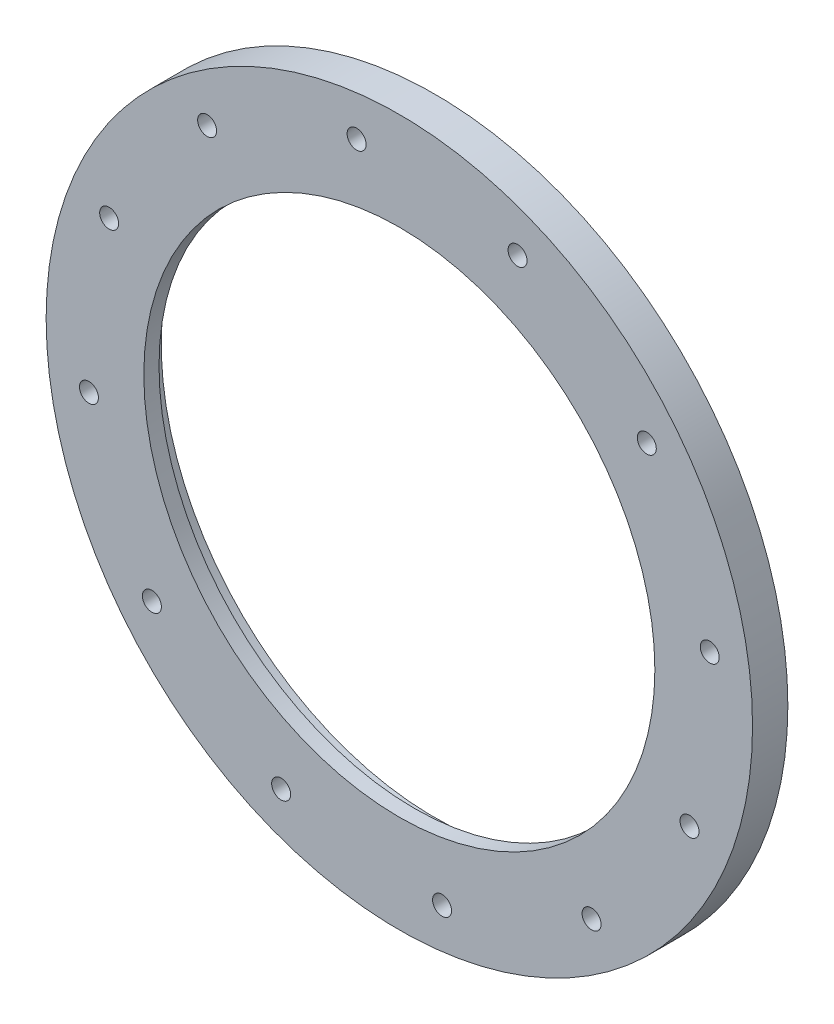
ISO-10303-21;
HEADER;
FILE_DESCRIPTION(('STEP AP214'),'2;1');
FILE_NAME('part.step','',(''),(''),'','','');
FILE_SCHEMA(('AUTOMOTIVE_DESIGN { 1 0 10303 214 1 1 1 1 }'));
ENDSEC;
DATA;
#1=APPLICATION_CONTEXT('core data for automotive mechanical design processes');
#2=APPLICATION_PROTOCOL_DEFINITION('international standard','automotive_design',2000,#1);
#3=PRODUCT_CONTEXT('',#1,'mechanical');
#4=PRODUCT('Part','Part','',(#3));
#5=PRODUCT_RELATED_PRODUCT_CATEGORY('part','',(#4));
#6=PRODUCT_DEFINITION_FORMATION('','',#4);
#7=PRODUCT_DEFINITION_CONTEXT('part definition',#1,'design');
#8=PRODUCT_DEFINITION('design','',#6,#7);
#9=PRODUCT_DEFINITION_SHAPE('','',#8);
#10=(LENGTH_UNIT() NAMED_UNIT(*) SI_UNIT(.MILLI.,.METRE.));
#11=(NAMED_UNIT(*) PLANE_ANGLE_UNIT() SI_UNIT($,.RADIAN.));
#12=(NAMED_UNIT(*) SI_UNIT($,.STERADIAN.) SOLID_ANGLE_UNIT());
#13=UNCERTAINTY_MEASURE_WITH_UNIT(LENGTH_MEASURE(1.E-05),#10,'distance_accuracy_value','');
#14=(GEOMETRIC_REPRESENTATION_CONTEXT(3) GLOBAL_UNCERTAINTY_ASSIGNED_CONTEXT((#13)) GLOBAL_UNIT_ASSIGNED_CONTEXT((#10,
#11,#12)) REPRESENTATION_CONTEXT('',''));
#15=CARTESIAN_POINT('',(0.,0.,0.));
#16=DIRECTION('',(0.,0.,1.));
#17=DIRECTION('',(1.,0.,0.));
#18=AXIS2_PLACEMENT_3D('',#15,#16,#17);
#19=CARTESIAN_POINT('',(0.,0.,2.325));
#20=DIRECTION('',(0.,0.,-1.));
#21=DIRECTION('',(-1.,0.,0.));
#22=AXIS2_PLACEMENT_3D('',#19,#20,#21);
#23=CYLINDRICAL_SURFACE('',#22,36.);
#24=CARTESIAN_POINT('',(0.,0.,-2.325));
#25=DIRECTION('',(0.,0.,1.));
#26=DIRECTION('',(1.,0.,0.));
#27=AXIS2_PLACEMENT_3D('',#24,#25,#26);
#28=CIRCLE('',#27,36.);
#29=CARTESIAN_POINT('',(36.,0.,-2.325));
#30=VERTEX_POINT('',#29);
#31=EDGE_CURVE('E50',#30,#30,#28,.T.);
#32=ORIENTED_EDGE('',*,*,#31,.F.);
#33=EDGE_LOOP('',(#32));
#34=FACE_BOUND('',#33,.T.);
#35=CARTESIAN_POINT('',(0.,0.,0.325));
#36=DIRECTION('',(0.,0.,1.));
#37=DIRECTION('',(1.,0.,0.));
#38=AXIS2_PLACEMENT_3D('',#35,#36,#37);
#39=CIRCLE('',#38,36.);
#40=CARTESIAN_POINT('',(36.,0.,0.325));
#41=VERTEX_POINT('',#40);
#42=EDGE_CURVE('E54',#41,#41,#39,.T.);
#43=ORIENTED_EDGE('',*,*,#42,.T.);
#44=EDGE_LOOP('',(#43));
#45=FACE_BOUND('',#44,.T.);
#46=ADVANCED_FACE('F39',(#34,#45),#23,.F.);
#47=CARTESIAN_POINT('',(0.,0.,2.325));
#48=DIRECTION('',(0.,0.,1.));
#49=DIRECTION('',(1.,0.,0.));
#50=AXIS2_PLACEMENT_3D('',#47,#48,#49);
#51=PLANE('',#50);
#52=CARTESIAN_POINT('',(-32.5768062822461,-25.3044302929154,2.325));
#53=DIRECTION('',(0.,0.,1.));
#54=DIRECTION('',(1.,0.,0.));
#55=AXIS2_PLACEMENT_3D('',#52,#53,#54);
#56=CIRCLE('',#55,1.24999999997321);
#57=CARTESIAN_POINT('',(-31.3268062822729,-25.3044302929154,2.325));
#58=VERTEX_POINT('',#57);
#59=EDGE_CURVE('E61',#58,#58,#56,.T.);
#60=ORIENTED_EDGE('',*,*,#59,.F.);
#61=EDGE_LOOP('',(#60));
#62=FACE_BOUND('',#61,.T.);
#63=CARTESIAN_POINT('',(-40.8645569610474,-5.62587632083429,2.325));
#64=DIRECTION('',(0.,0.,1.));
#65=DIRECTION('',(1.,0.,0.));
#66=AXIS2_PLACEMENT_3D('',#63,#64,#65);
#67=CIRCLE('',#66,1.24999999997339);
#68=CARTESIAN_POINT('',(-39.614556961074,-5.62587632083429,2.325));
#69=VERTEX_POINT('',#68);
#70=EDGE_CURVE('E66',#69,#69,#67,.T.);
#71=ORIENTED_EDGE('',*,*,#70,.F.);
#72=EDGE_LOOP('',(#71));
#73=FACE_BOUND('',#72,.T.);
#74=CARTESIAN_POINT('',(-38.2026826030805,15.5601266681318,2.325));
#75=DIRECTION('',(0.,0.,1.));
#76=DIRECTION('',(1.,0.,0.));
#77=AXIS2_PLACEMENT_3D('',#74,#75,#76);
#78=CIRCLE('',#77,1.2499999999772);
#79=CARTESIAN_POINT('',(-36.9526826031033,15.5601266681318,2.325));
#80=VERTEX_POINT('',#79);
#81=EDGE_CURVE('E69',#80,#80,#78,.T.);
#82=ORIENTED_EDGE('',*,*,#81,.F.);
#83=EDGE_LOOP('',(#82));
#84=FACE_BOUND('',#83,.T.);
#85=CARTESIAN_POINT('',(-25.3044302929156,32.576806282246,2.325));
#86=DIRECTION('',(0.,0.,1.));
#87=DIRECTION('',(1.,0.,0.));
#88=AXIS2_PLACEMENT_3D('',#85,#86,#87);
#89=CIRCLE('',#88,1.24999999998368);
#90=CARTESIAN_POINT('',(-24.0544302929319,32.576806282246,2.325));
#91=VERTEX_POINT('',#90);
#92=EDGE_CURVE('E72',#91,#91,#89,.T.);
#93=ORIENTED_EDGE('',*,*,#92,.F.);
#94=EDGE_LOOP('',(#93));
#95=FACE_BOUND('',#94,.T.);
#96=CARTESIAN_POINT('',(-5.62587632083439,40.8645569610473,2.325));
#97=DIRECTION('',(0.,0.,1.));
#98=DIRECTION('',(1.,0.,0.));
#99=AXIS2_PLACEMENT_3D('',#96,#97,#98);
#100=CIRCLE('',#99,1.24999999999082);
#101=CARTESIAN_POINT('',(-4.37587632084357,40.8645569610473,2.325));
#102=VERTEX_POINT('',#101);
#103=EDGE_CURVE('E75',#102,#102,#100,.T.);
#104=ORIENTED_EDGE('',*,*,#103,.F.);
#105=EDGE_LOOP('',(#104));
#106=FACE_BOUND('',#105,.T.);
#107=CARTESIAN_POINT('',(15.5601266681316,38.2026826030803,2.325));
#108=DIRECTION('',(0.,0.,1.));
#109=DIRECTION('',(1.,0.,0.));
#110=AXIS2_PLACEMENT_3D('',#107,#108,#109);
#111=CIRCLE('',#110,1.24999999999688);
#112=CARTESIAN_POINT('',(16.8101266681285,38.2026826030803,2.325));
#113=VERTEX_POINT('',#112);
#114=EDGE_CURVE('E78',#113,#113,#111,.T.);
#115=ORIENTED_EDGE('',*,*,#114,.F.);
#116=EDGE_LOOP('',(#115));
#117=FACE_BOUND('',#116,.T.);
#118=CARTESIAN_POINT('',(32.5768062822459,25.3044302929154,2.325));
#119=DIRECTION('',(0.,0.,1.));
#120=DIRECTION('',(1.,0.,0.));
#121=AXIS2_PLACEMENT_3D('',#118,#119,#120);
#122=CIRCLE('',#121,1.25000000000036);
#123=CARTESIAN_POINT('',(33.8268062822462,25.3044302929154,2.325));
#124=VERTEX_POINT('',#123);
#125=EDGE_CURVE('E81',#124,#124,#122,.T.);
#126=ORIENTED_EDGE('',*,*,#125,.F.);
#127=EDGE_LOOP('',(#126));
#128=FACE_BOUND('',#127,.T.);
#129=CARTESIAN_POINT('',(40.8645569610471,5.62587632083429,2.325));
#130=DIRECTION('',(0.,0.,1.));
#131=DIRECTION('',(1.,0.,0.));
#132=AXIS2_PLACEMENT_3D('',#129,#130,#131);
#133=CIRCLE('',#132,1.24999999999999);
#134=CARTESIAN_POINT('',(42.1145569610471,5.62587632083429,2.325));
#135=VERTEX_POINT('',#134);
#136=EDGE_CURVE('E84',#135,#135,#133,.T.);
#137=ORIENTED_EDGE('',*,*,#136,.F.);
#138=EDGE_LOOP('',(#137));
#139=FACE_BOUND('',#138,.T.);
#140=CARTESIAN_POINT('',(38.2026826030802,-15.5601266681318,2.325));
#141=DIRECTION('',(0.,0.,1.));
#142=DIRECTION('',(1.,0.,0.));
#143=AXIS2_PLACEMENT_3D('',#140,#141,#142);
#144=CIRCLE('',#143,1.24999999999662);
#145=CARTESIAN_POINT('',(39.4526826030768,-15.5601266681318,2.325));
#146=VERTEX_POINT('',#145);
#147=EDGE_CURVE('E87',#146,#146,#144,.T.);
#148=ORIENTED_EDGE('',*,*,#147,.F.);
#149=EDGE_LOOP('',(#148));
#150=FACE_BOUND('',#149,.T.);
#151=CARTESIAN_POINT('',(25.3044302929153,-32.576806282246,2.325));
#152=DIRECTION('',(0.,0.,1.));
#153=DIRECTION('',(1.,0.,0.));
#154=AXIS2_PLACEMENT_3D('',#151,#152,#153);
#155=CIRCLE('',#154,1.24999999999025);
#156=CARTESIAN_POINT('',(26.5544302929056,-32.576806282246,2.325));
#157=VERTEX_POINT('',#156);
#158=EDGE_CURVE('E90',#157,#157,#155,.T.);
#159=ORIENTED_EDGE('',*,*,#158,.F.);
#160=EDGE_LOOP('',(#159));
#161=FACE_BOUND('',#160,.T.);
#162=CARTESIAN_POINT('',(5.62587632083417,-40.8645569610473,2.325));
#163=DIRECTION('',(0.,0.,1.));
#164=DIRECTION('',(1.,0.,0.));
#165=AXIS2_PLACEMENT_3D('',#162,#163,#164);
#166=CIRCLE('',#165,1.24999999998286);
#167=CARTESIAN_POINT('',(6.87587632081703,-40.8645569610473,2.325));
#168=VERTEX_POINT('',#167);
#169=EDGE_CURVE('E93',#168,#168,#166,.T.);
#170=ORIENTED_EDGE('',*,*,#169,.F.);
#171=EDGE_LOOP('',(#170));
#172=FACE_BOUND('',#171,.T.);
#173=CARTESIAN_POINT('',(-15.5601266681319,-38.2026826030803,2.325));
#174=DIRECTION('',(0.,0.,1.));
#175=DIRECTION('',(1.,0.,0.));
#176=AXIS2_PLACEMENT_3D('',#173,#174,#175);
#177=CIRCLE('',#176,1.24999999997657);
#178=CARTESIAN_POINT('',(-14.3101266681554,-38.2026826030803,2.325));
#179=VERTEX_POINT('',#178);
#180=EDGE_CURVE('E96',#179,#179,#177,.T.);
#181=ORIENTED_EDGE('',*,*,#180,.F.);
#182=EDGE_LOOP('',(#181));
#183=FACE_BOUND('',#182,.T.);
#184=CARTESIAN_POINT('',(0.,0.,2.325));
#185=DIRECTION('',(0.,0.,1.));
#186=DIRECTION('',(1.,0.,0.));
#187=AXIS2_PLACEMENT_3D('',#184,#185,#186);
#188=CIRCLE('',#187,46.5);
#189=CARTESIAN_POINT('',(46.5,0.,2.325));
#190=VERTEX_POINT('',#189);
#191=EDGE_CURVE('E10',#190,#190,#188,.T.);
#192=ORIENTED_EDGE('',*,*,#191,.T.);
#193=EDGE_LOOP('',(#192));
#194=FACE_BOUND('',#193,.T.);
#195=CARTESIAN_POINT('',(0.,0.,2.325));
#196=DIRECTION('',(0.,0.,1.));
#197=DIRECTION('',(1.,0.,0.));
#198=AXIS2_PLACEMENT_3D('',#195,#196,#197);
#199=CIRCLE('',#198,33.63888889);
#200=CARTESIAN_POINT('',(33.63888889,0.,2.325));
#201=VERTEX_POINT('',#200);
#202=EDGE_CURVE('E58',#201,#201,#199,.T.);
#203=ORIENTED_EDGE('',*,*,#202,.F.);
#204=EDGE_LOOP('',(#203));
#205=FACE_BOUND('',#204,.T.);
#206=ADVANCED_FACE('F156',(#62,#73,#84,#95,#106,#117,#128,#139,#150,#161,#172,#183,#194,#205),
#51,.T.);
#207=CARTESIAN_POINT('',(0.,0.,-2.325));
#208=DIRECTION('',(0.,0.,1.));
#209=DIRECTION('',(1.,0.,0.));
#210=AXIS2_PLACEMENT_3D('',#207,#208,#209);
#211=PLANE('',#210);
#212=CARTESIAN_POINT('',(-32.5768062822461,-25.3044302929154,-2.325));
#213=DIRECTION('',(0.,0.,1.));
#214=DIRECTION('',(1.,0.,0.));
#215=AXIS2_PLACEMENT_3D('',#212,#213,#214);
#216=CIRCLE('',#215,1.24999999997321);
#217=CARTESIAN_POINT('',(-31.3268062822729,-25.3044302929154,-2.325));
#218=VERTEX_POINT('',#217);
#219=EDGE_CURVE('E102',#218,#218,#216,.T.);
#220=ORIENTED_EDGE('',*,*,#219,.T.);
#221=EDGE_LOOP('',(#220));
#222=FACE_BOUND('',#221,.T.);
#223=CARTESIAN_POINT('',(-40.8645569610474,-5.62587632083429,-2.325));
#224=DIRECTION('',(0.,0.,1.));
#225=DIRECTION('',(1.,0.,0.));
#226=AXIS2_PLACEMENT_3D('',#223,#224,#225);
#227=CIRCLE('',#226,1.24999999997339);
#228=CARTESIAN_POINT('',(-39.614556961074,-5.62587632083429,-2.325));
#229=VERTEX_POINT('',#228);
#230=EDGE_CURVE('E122',#229,#229,#227,.T.);
#231=ORIENTED_EDGE('',*,*,#230,.T.);
#232=EDGE_LOOP('',(#231));
#233=FACE_BOUND('',#232,.T.);
#234=CARTESIAN_POINT('',(-38.2026826030805,15.5601266681318,-2.325));
#235=DIRECTION('',(0.,0.,1.));
#236=DIRECTION('',(1.,0.,0.));
#237=AXIS2_PLACEMENT_3D('',#234,#235,#236);
#238=CIRCLE('',#237,1.2499999999772);
#239=CARTESIAN_POINT('',(-36.9526826031033,15.5601266681318,-2.325));
#240=VERTEX_POINT('',#239);
#241=EDGE_CURVE('E119',#240,#240,#238,.T.);
#242=ORIENTED_EDGE('',*,*,#241,.T.);
#243=EDGE_LOOP('',(#242));
#244=FACE_BOUND('',#243,.T.);
#245=CARTESIAN_POINT('',(-25.3044302929156,32.576806282246,-2.325));
#246=DIRECTION('',(0.,0.,1.));
#247=DIRECTION('',(1.,0.,0.));
#248=AXIS2_PLACEMENT_3D('',#245,#246,#247);
#249=CIRCLE('',#248,1.24999999998368);
#250=CARTESIAN_POINT('',(-24.0544302929319,32.576806282246,-2.325));
#251=VERTEX_POINT('',#250);
#252=EDGE_CURVE('E116',#251,#251,#249,.T.);
#253=ORIENTED_EDGE('',*,*,#252,.T.);
#254=EDGE_LOOP('',(#253));
#255=FACE_BOUND('',#254,.T.);
#256=CARTESIAN_POINT('',(-5.62587632083439,40.8645569610473,-2.325));
#257=DIRECTION('',(0.,0.,1.));
#258=DIRECTION('',(1.,0.,0.));
#259=AXIS2_PLACEMENT_3D('',#256,#257,#258);
#260=CIRCLE('',#259,1.24999999999082);
#261=CARTESIAN_POINT('',(-4.37587632084357,40.8645569610473,-2.325));
#262=VERTEX_POINT('',#261);
#263=EDGE_CURVE('E113',#262,#262,#260,.T.);
#264=ORIENTED_EDGE('',*,*,#263,.T.);
#265=EDGE_LOOP('',(#264));
#266=FACE_BOUND('',#265,.T.);
#267=CARTESIAN_POINT('',(15.5601266681316,38.2026826030803,-2.325));
#268=DIRECTION('',(0.,0.,1.));
#269=DIRECTION('',(1.,0.,0.));
#270=AXIS2_PLACEMENT_3D('',#267,#268,#269);
#271=CIRCLE('',#270,1.24999999999688);
#272=CARTESIAN_POINT('',(16.8101266681285,38.2026826030803,-2.325));
#273=VERTEX_POINT('',#272);
#274=EDGE_CURVE('E110',#273,#273,#271,.T.);
#275=ORIENTED_EDGE('',*,*,#274,.T.);
#276=EDGE_LOOP('',(#275));
#277=FACE_BOUND('',#276,.T.);
#278=CARTESIAN_POINT('',(32.5768062822459,25.3044302929154,-2.325));
#279=DIRECTION('',(0.,0.,1.));
#280=DIRECTION('',(1.,0.,0.));
#281=AXIS2_PLACEMENT_3D('',#278,#279,#280);
#282=CIRCLE('',#281,1.25000000000036);
#283=CARTESIAN_POINT('',(33.8268062822462,25.3044302929154,-2.325));
#284=VERTEX_POINT('',#283);
#285=EDGE_CURVE('E106',#284,#284,#282,.T.);
#286=ORIENTED_EDGE('',*,*,#285,.T.);
#287=EDGE_LOOP('',(#286));
#288=FACE_BOUND('',#287,.T.);
#289=CARTESIAN_POINT('',(40.8645569610471,5.62587632083429,-2.325));
#290=DIRECTION('',(0.,0.,1.));
#291=DIRECTION('',(1.,0.,0.));
#292=AXIS2_PLACEMENT_3D('',#289,#290,#291);
#293=CIRCLE('',#292,1.24999999999999);
#294=CARTESIAN_POINT('',(42.1145569610471,5.62587632083429,-2.325));
#295=VERTEX_POINT('',#294);
#296=EDGE_CURVE('E103',#295,#295,#293,.T.);
#297=ORIENTED_EDGE('',*,*,#296,.T.);
#298=EDGE_LOOP('',(#297));
#299=FACE_BOUND('',#298,.T.);
#300=CARTESIAN_POINT('',(38.2026826030802,-15.5601266681318,-2.325));
#301=DIRECTION('',(0.,0.,1.));
#302=DIRECTION('',(1.,0.,0.));
#303=AXIS2_PLACEMENT_3D('',#300,#301,#302);
#304=CIRCLE('',#303,1.24999999999662);
#305=CARTESIAN_POINT('',(39.4526826030768,-15.5601266681318,-2.325));
#306=VERTEX_POINT('',#305);
#307=EDGE_CURVE('E107',#306,#306,#304,.T.);
#308=ORIENTED_EDGE('',*,*,#307,.T.);
#309=EDGE_LOOP('',(#308));
#310=FACE_BOUND('',#309,.T.);
#311=CARTESIAN_POINT('',(25.3044302929153,-32.576806282246,-2.325));
#312=DIRECTION('',(0.,0.,1.));
#313=DIRECTION('',(1.,0.,0.));
#314=AXIS2_PLACEMENT_3D('',#311,#312,#313);
#315=CIRCLE('',#314,1.24999999999025);
#316=CARTESIAN_POINT('',(26.5544302929056,-32.576806282246,-2.325));
#317=VERTEX_POINT('',#316);
#318=EDGE_CURVE('E130',#317,#317,#315,.T.);
#319=ORIENTED_EDGE('',*,*,#318,.T.);
#320=EDGE_LOOP('',(#319));
#321=FACE_BOUND('',#320,.T.);
#322=CARTESIAN_POINT('',(5.62587632083417,-40.8645569610473,-2.325));
#323=DIRECTION('',(0.,0.,1.));
#324=DIRECTION('',(1.,0.,0.));
#325=AXIS2_PLACEMENT_3D('',#322,#323,#324);
#326=CIRCLE('',#325,1.24999999998286);
#327=CARTESIAN_POINT('',(6.87587632081703,-40.8645569610473,-2.325));
#328=VERTEX_POINT('',#327);
#329=EDGE_CURVE('E127',#328,#328,#326,.T.);
#330=ORIENTED_EDGE('',*,*,#329,.T.);
#331=EDGE_LOOP('',(#330));
#332=FACE_BOUND('',#331,.T.);
#333=CARTESIAN_POINT('',(-15.5601266681319,-38.2026826030803,-2.325));
#334=DIRECTION('',(0.,0.,1.));
#335=DIRECTION('',(1.,0.,0.));
#336=AXIS2_PLACEMENT_3D('',#333,#334,#335);
#337=CIRCLE('',#336,1.24999999997657);
#338=CARTESIAN_POINT('',(-14.3101266681554,-38.2026826030803,-2.325));
#339=VERTEX_POINT('',#338);
#340=EDGE_CURVE('E99',#339,#339,#337,.T.);
#341=ORIENTED_EDGE('',*,*,#340,.T.);
#342=EDGE_LOOP('',(#341));
#343=FACE_BOUND('',#342,.T.);
#344=CARTESIAN_POINT('',(0.,0.,-2.325));
#345=DIRECTION('',(0.,0.,1.));
#346=DIRECTION('',(1.,0.,0.));
#347=AXIS2_PLACEMENT_3D('',#344,#345,#346);
#348=CIRCLE('',#347,46.5);
#349=CARTESIAN_POINT('',(46.5,0.,-2.325));
#350=VERTEX_POINT('',#349);
#351=EDGE_CURVE('E43',#350,#350,#348,.T.);
#352=ORIENTED_EDGE('',*,*,#351,.F.);
#353=EDGE_LOOP('',(#352));
#354=FACE_BOUND('',#353,.T.);
#355=ORIENTED_EDGE('',*,*,#31,.T.);
#356=EDGE_LOOP('',(#355));
#357=FACE_BOUND('',#356,.T.);
#358=ADVANCED_FACE('F136',(#222,#233,#244,#255,#266,#277,#288,#299,#310,#321,#332,#343,#354,
#357),#211,.F.);
#359=CARTESIAN_POINT('',(0.,0.,2.325));
#360=DIRECTION('',(0.,0.,-1.));
#361=DIRECTION('',(-1.,0.,0.));
#362=AXIS2_PLACEMENT_3D('',#359,#360,#361);
#363=CYLINDRICAL_SURFACE('',#362,46.5);
#364=ORIENTED_EDGE('',*,*,#191,.F.);
#365=EDGE_LOOP('',(#364));
#366=FACE_BOUND('',#365,.T.);
#367=ORIENTED_EDGE('',*,*,#351,.T.);
#368=EDGE_LOOP('',(#367));
#369=FACE_BOUND('',#368,.T.);
#370=ADVANCED_FACE('F41',(#366,#369),#363,.T.);
#371=CARTESIAN_POINT('',(0.,0.,0.325));
#372=DIRECTION('',(0.,0.,1.));
#373=DIRECTION('',(1.,0.,0.));
#374=AXIS2_PLACEMENT_3D('',#371,#372,#373);
#375=PLANE('',#374);
#376=CARTESIAN_POINT('',(0.,0.,0.325));
#377=DIRECTION('',(0.,0.,1.));
#378=DIRECTION('',(1.,0.,0.));
#379=AXIS2_PLACEMENT_3D('',#376,#377,#378);
#380=CIRCLE('',#379,33.63888889);
#381=CARTESIAN_POINT('',(33.63888889,0.,0.325));
#382=VERTEX_POINT('',#381);
#383=EDGE_CURVE('E57',#382,#382,#380,.T.);
#384=ORIENTED_EDGE('',*,*,#383,.T.);
#385=EDGE_LOOP('',(#384));
#386=FACE_BOUND('',#385,.T.);
#387=ORIENTED_EDGE('',*,*,#42,.F.);
#388=EDGE_LOOP('',(#387));
#389=FACE_BOUND('',#388,.T.);
#390=ADVANCED_FACE('F169',(#386,#389),#375,.F.);
#391=CARTESIAN_POINT('',(0.,0.,0.325));
#392=DIRECTION('',(0.,0.,1.));
#393=DIRECTION('',(1.,0.,0.));
#394=AXIS2_PLACEMENT_3D('',#391,#392,#393);
#395=CYLINDRICAL_SURFACE('',#394,33.63888889);
#396=ORIENTED_EDGE('',*,*,#383,.F.);
#397=EDGE_LOOP('',(#396));
#398=FACE_BOUND('',#397,.T.);
#399=ORIENTED_EDGE('',*,*,#202,.T.);
#400=EDGE_LOOP('',(#399));
#401=FACE_BOUND('',#400,.T.);
#402=ADVANCED_FACE('F207',(#398,#401),#395,.F.);
#403=CARTESIAN_POINT('',(-15.5601266681319,-38.2026826030803,-2.325));
#404=DIRECTION('',(0.,0.,1.));
#405=DIRECTION('',(1.,0.,0.));
#406=AXIS2_PLACEMENT_3D('',#403,#404,#405);
#407=CYLINDRICAL_SURFACE('',#406,1.24999999997657);
#408=ORIENTED_EDGE('',*,*,#180,.T.);
#409=EDGE_LOOP('',(#408));
#410=FACE_BOUND('',#409,.T.);
#411=ORIENTED_EDGE('',*,*,#340,.F.);
#412=EDGE_LOOP('',(#411));
#413=FACE_BOUND('',#412,.T.);
#414=ADVANCED_FACE('F206',(#410,#413),#407,.F.);
#415=CARTESIAN_POINT('',(5.62587632083417,-40.8645569610473,-2.325));
#416=DIRECTION('',(0.,0.,1.));
#417=DIRECTION('',(1.,0.,0.));
#418=AXIS2_PLACEMENT_3D('',#415,#416,#417);
#419=CYLINDRICAL_SURFACE('',#418,1.24999999998286);
#420=ORIENTED_EDGE('',*,*,#169,.T.);
#421=EDGE_LOOP('',(#420));
#422=FACE_BOUND('',#421,.T.);
#423=ORIENTED_EDGE('',*,*,#329,.F.);
#424=EDGE_LOOP('',(#423));
#425=FACE_BOUND('',#424,.T.);
#426=ADVANCED_FACE('F152',(#422,#425),#419,.F.);
#427=CARTESIAN_POINT('',(25.3044302929153,-32.576806282246,-2.325));
#428=DIRECTION('',(0.,0.,1.));
#429=DIRECTION('',(1.,0.,0.));
#430=AXIS2_PLACEMENT_3D('',#427,#428,#429);
#431=CYLINDRICAL_SURFACE('',#430,1.24999999999025);
#432=ORIENTED_EDGE('',*,*,#158,.T.);
#433=EDGE_LOOP('',(#432));
#434=FACE_BOUND('',#433,.T.);
#435=ORIENTED_EDGE('',*,*,#318,.F.);
#436=EDGE_LOOP('',(#435));
#437=FACE_BOUND('',#436,.T.);
#438=ADVANCED_FACE('F142',(#434,#437),#431,.F.);
#439=CARTESIAN_POINT('',(38.2026826030802,-15.5601266681318,-2.325));
#440=DIRECTION('',(0.,0.,1.));
#441=DIRECTION('',(1.,0.,0.));
#442=AXIS2_PLACEMENT_3D('',#439,#440,#441);
#443=CYLINDRICAL_SURFACE('',#442,1.24999999999662);
#444=ORIENTED_EDGE('',*,*,#147,.T.);
#445=EDGE_LOOP('',(#444));
#446=FACE_BOUND('',#445,.T.);
#447=ORIENTED_EDGE('',*,*,#307,.F.);
#448=EDGE_LOOP('',(#447));
#449=FACE_BOUND('',#448,.T.);
#450=ADVANCED_FACE('F139',(#446,#449),#443,.F.);
#451=CARTESIAN_POINT('',(40.8645569610471,5.62587632083429,-2.325));
#452=DIRECTION('',(0.,0.,1.));
#453=DIRECTION('',(1.,0.,0.));
#454=AXIS2_PLACEMENT_3D('',#451,#452,#453);
#455=CYLINDRICAL_SURFACE('',#454,1.24999999999999);
#456=ORIENTED_EDGE('',*,*,#136,.T.);
#457=EDGE_LOOP('',(#456));
#458=FACE_BOUND('',#457,.T.);
#459=ORIENTED_EDGE('',*,*,#296,.F.);
#460=EDGE_LOOP('',(#459));
#461=FACE_BOUND('',#460,.T.);
#462=ADVANCED_FACE('F141',(#458,#461),#455,.F.);
#463=CARTESIAN_POINT('',(32.5768062822459,25.3044302929154,-2.325));
#464=DIRECTION('',(0.,0.,1.));
#465=DIRECTION('',(1.,0.,0.));
#466=AXIS2_PLACEMENT_3D('',#463,#464,#465);
#467=CYLINDRICAL_SURFACE('',#466,1.25000000000036);
#468=ORIENTED_EDGE('',*,*,#125,.T.);
#469=EDGE_LOOP('',(#468));
#470=FACE_BOUND('',#469,.T.);
#471=ORIENTED_EDGE('',*,*,#285,.F.);
#472=EDGE_LOOP('',(#471));
#473=FACE_BOUND('',#472,.T.);
#474=ADVANCED_FACE('F149',(#470,#473),#467,.F.);
#475=CARTESIAN_POINT('',(15.5601266681316,38.2026826030803,-2.325));
#476=DIRECTION('',(0.,0.,1.));
#477=DIRECTION('',(1.,0.,0.));
#478=AXIS2_PLACEMENT_3D('',#475,#476,#477);
#479=CYLINDRICAL_SURFACE('',#478,1.24999999999688);
#480=ORIENTED_EDGE('',*,*,#114,.T.);
#481=EDGE_LOOP('',(#480));
#482=FACE_BOUND('',#481,.T.);
#483=ORIENTED_EDGE('',*,*,#274,.F.);
#484=EDGE_LOOP('',(#483));
#485=FACE_BOUND('',#484,.T.);
#486=ADVANCED_FACE('F195',(#482,#485),#479,.F.);
#487=CARTESIAN_POINT('',(-5.62587632083439,40.8645569610473,-2.325));
#488=DIRECTION('',(0.,0.,1.));
#489=DIRECTION('',(1.,0.,0.));
#490=AXIS2_PLACEMENT_3D('',#487,#488,#489);
#491=CYLINDRICAL_SURFACE('',#490,1.24999999999082);
#492=ORIENTED_EDGE('',*,*,#103,.T.);
#493=EDGE_LOOP('',(#492));
#494=FACE_BOUND('',#493,.T.);
#495=ORIENTED_EDGE('',*,*,#263,.F.);
#496=EDGE_LOOP('',(#495));
#497=FACE_BOUND('',#496,.T.);
#498=ADVANCED_FACE('F201',(#494,#497),#491,.F.);
#499=CARTESIAN_POINT('',(-25.3044302929156,32.576806282246,-2.325));
#500=DIRECTION('',(0.,0.,1.));
#501=DIRECTION('',(1.,0.,0.));
#502=AXIS2_PLACEMENT_3D('',#499,#500,#501);
#503=CYLINDRICAL_SURFACE('',#502,1.24999999998368);
#504=ORIENTED_EDGE('',*,*,#92,.T.);
#505=EDGE_LOOP('',(#504));
#506=FACE_BOUND('',#505,.T.);
#507=ORIENTED_EDGE('',*,*,#252,.F.);
#508=EDGE_LOOP('',(#507));
#509=FACE_BOUND('',#508,.T.);
#510=ADVANCED_FACE('F282',(#506,#509),#503,.F.);
#511=CARTESIAN_POINT('',(-38.2026826030805,15.5601266681318,-2.325));
#512=DIRECTION('',(0.,0.,1.));
#513=DIRECTION('',(1.,0.,0.));
#514=AXIS2_PLACEMENT_3D('',#511,#512,#513);
#515=CYLINDRICAL_SURFACE('',#514,1.2499999999772);
#516=ORIENTED_EDGE('',*,*,#81,.T.);
#517=EDGE_LOOP('',(#516));
#518=FACE_BOUND('',#517,.T.);
#519=ORIENTED_EDGE('',*,*,#241,.F.);
#520=EDGE_LOOP('',(#519));
#521=FACE_BOUND('',#520,.T.);
#522=ADVANCED_FACE('F291',(#518,#521),#515,.F.);
#523=CARTESIAN_POINT('',(-40.8645569610474,-5.62587632083429,-2.325));
#524=DIRECTION('',(0.,0.,1.));
#525=DIRECTION('',(1.,0.,0.));
#526=AXIS2_PLACEMENT_3D('',#523,#524,#525);
#527=CYLINDRICAL_SURFACE('',#526,1.24999999997339);
#528=ORIENTED_EDGE('',*,*,#70,.T.);
#529=EDGE_LOOP('',(#528));
#530=FACE_BOUND('',#529,.T.);
#531=ORIENTED_EDGE('',*,*,#230,.F.);
#532=EDGE_LOOP('',(#531));
#533=FACE_BOUND('',#532,.T.);
#534=ADVANCED_FACE('F301',(#530,#533),#527,.F.);
#535=CARTESIAN_POINT('',(-32.5768062822461,-25.3044302929154,-2.325));
#536=DIRECTION('',(0.,0.,1.));
#537=DIRECTION('',(1.,0.,0.));
#538=AXIS2_PLACEMENT_3D('',#535,#536,#537);
#539=CYLINDRICAL_SURFACE('',#538,1.24999999997321);
#540=ORIENTED_EDGE('',*,*,#59,.T.);
#541=EDGE_LOOP('',(#540));
#542=FACE_BOUND('',#541,.T.);
#543=ORIENTED_EDGE('',*,*,#219,.F.);
#544=EDGE_LOOP('',(#543));
#545=FACE_BOUND('',#544,.T.);
#546=ADVANCED_FACE('F311',(#542,#545),#539,.F.);
#547=CLOSED_SHELL('',(#46,#206,#358,#370,#390,#402,#414,#426,#438,#450,#462,#474,#486,#498,#510,
#522,#534,#546));
#548=MANIFOLD_SOLID_BREP('B2',#547);
#549=ADVANCED_BREP_SHAPE_REPRESENTATION('',(#18,#548),#14);
#550=SHAPE_DEFINITION_REPRESENTATION(#9,#549);
ENDSEC;
END-ISO-10303-21;
